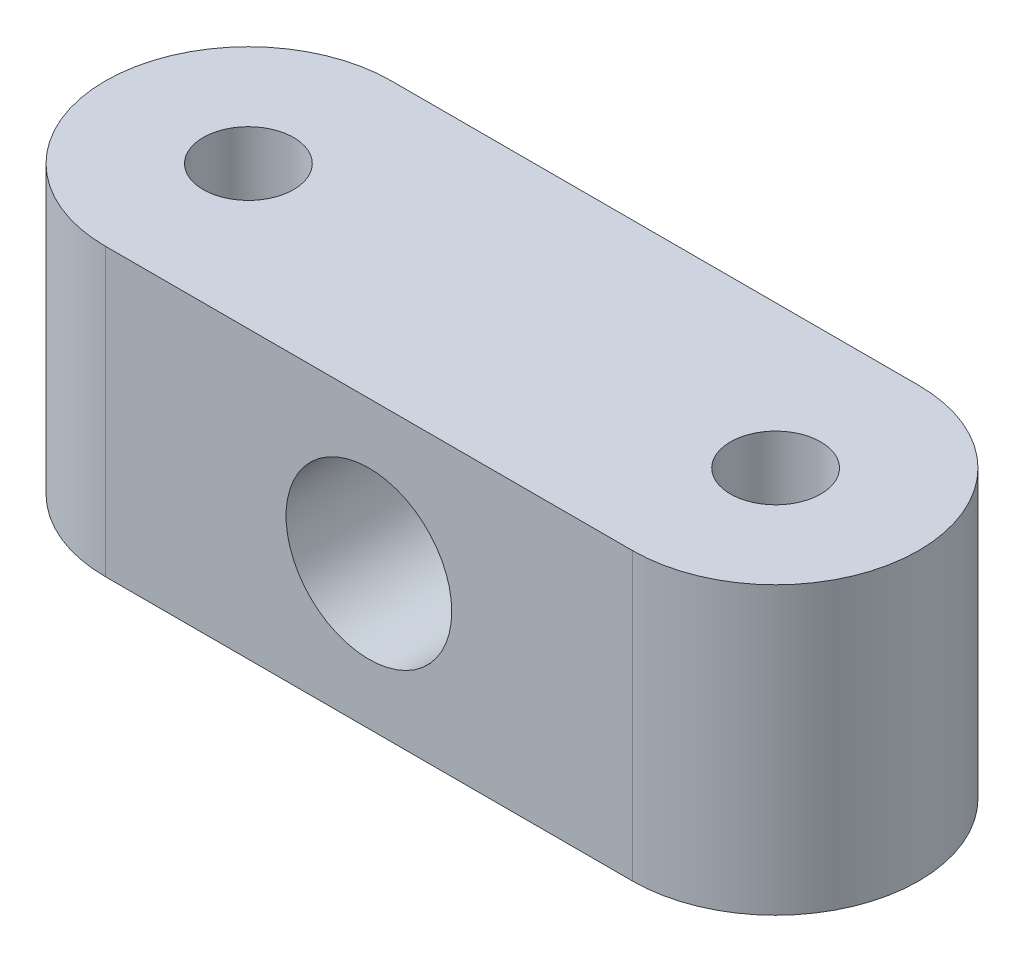
ISO-10303-21;
HEADER;
FILE_DESCRIPTION(('STEP AP214'),'2;1');
FILE_NAME('part.step','',(''),(''),'','','');
FILE_SCHEMA(('AUTOMOTIVE_DESIGN { 1 0 10303 214 1 1 1 1 }'));
ENDSEC;
DATA;
#1=APPLICATION_CONTEXT('core data for automotive mechanical design processes');
#2=APPLICATION_PROTOCOL_DEFINITION('international standard','automotive_design',2000,#1);
#3=PRODUCT_CONTEXT('',#1,'mechanical');
#4=PRODUCT('Part','Part','',(#3));
#5=PRODUCT_RELATED_PRODUCT_CATEGORY('part','',(#4));
#6=PRODUCT_DEFINITION_FORMATION('','',#4);
#7=PRODUCT_DEFINITION_CONTEXT('part definition',#1,'design');
#8=PRODUCT_DEFINITION('design','',#6,#7);
#9=PRODUCT_DEFINITION_SHAPE('','',#8);
#10=(LENGTH_UNIT() NAMED_UNIT(*) SI_UNIT(.MILLI.,.METRE.));
#11=(NAMED_UNIT(*) PLANE_ANGLE_UNIT() SI_UNIT($,.RADIAN.));
#12=(NAMED_UNIT(*) SI_UNIT($,.STERADIAN.) SOLID_ANGLE_UNIT());
#13=UNCERTAINTY_MEASURE_WITH_UNIT(LENGTH_MEASURE(1.E-05),#10,'distance_accuracy_value','');
#14=(GEOMETRIC_REPRESENTATION_CONTEXT(3) GLOBAL_UNCERTAINTY_ASSIGNED_CONTEXT((#13)) GLOBAL_UNIT_ASSIGNED_CONTEXT((#10,
#11,#12)) REPRESENTATION_CONTEXT('',''));
#15=CARTESIAN_POINT('',(0.,0.,0.));
#16=DIRECTION('',(0.,0.,1.));
#17=DIRECTION('',(1.,0.,0.));
#18=AXIS2_PLACEMENT_3D('',#15,#16,#17);
#19=CARTESIAN_POINT('',(35.,38.,0.));
#20=DIRECTION('',(0.,-1.,0.));
#21=DIRECTION('',(0.,0.,-1.));
#22=AXIS2_PLACEMENT_3D('',#19,#20,#21);
#23=PLANE('',#22);
#24=CARTESIAN_POINT('',(35.,38.,0.));
#25=DIRECTION('',(0.,1.,0.));
#26=DIRECTION('',(0.,0.,-1.));
#27=AXIS2_PLACEMENT_3D('',#24,#25,#26);
#28=CIRCLE('',#27,19.);
#29=CARTESIAN_POINT('',(35.,38.,19.));
#30=VERTEX_POINT('',#29);
#31=CARTESIAN_POINT('',(35.,38.,-19.));
#32=VERTEX_POINT('',#31);
#33=EDGE_CURVE('E91',#30,#32,#28,.T.);
#34=ORIENTED_EDGE('',*,*,#33,.T.);
#35=DIRECTION('',(-1.,0.,0.));
#36=VECTOR('',#35,1.);
#37=CARTESIAN_POINT('',(-35.,38.,-19.));
#38=LINE('',#37,#36);
#39=CARTESIAN_POINT('',(-35.,38.,-19.));
#40=VERTEX_POINT('',#39);
#41=EDGE_CURVE('E86',#32,#40,#38,.T.);
#42=ORIENTED_EDGE('',*,*,#41,.T.);
#43=CARTESIAN_POINT('',(-35.,38.,0.));
#44=DIRECTION('',(0.,1.,0.));
#45=DIRECTION('',(0.,0.,1.));
#46=AXIS2_PLACEMENT_3D('',#43,#44,#45);
#47=CIRCLE('',#46,19.);
#48=CARTESIAN_POINT('',(-35.,38.,19.));
#49=VERTEX_POINT('',#48);
#50=EDGE_CURVE('E89',#40,#49,#47,.T.);
#51=ORIENTED_EDGE('',*,*,#50,.T.);
#52=DIRECTION('',(1.,0.,0.));
#53=VECTOR('',#52,1.);
#54=CARTESIAN_POINT('',(-35.,38.,19.));
#55=LINE('',#54,#53);
#56=EDGE_CURVE('E56',#49,#30,#55,.T.);
#57=ORIENTED_EDGE('',*,*,#56,.T.);
#58=EDGE_LOOP('',(#34,#42,#51,#57));
#59=FACE_BOUND('',#58,.T.);
#60=CARTESIAN_POINT('',(-35.,38.,0.));
#61=DIRECTION('',(0.,1.,0.));
#62=DIRECTION('',(0.,0.,1.));
#63=AXIS2_PLACEMENT_3D('',#60,#61,#62);
#64=CIRCLE('',#63,6.);
#65=CARTESIAN_POINT('',(-35.,38.,6.));
#66=VERTEX_POINT('',#65);
#67=EDGE_CURVE('E106',#66,#66,#64,.T.);
#68=ORIENTED_EDGE('',*,*,#67,.F.);
#69=EDGE_LOOP('',(#68));
#70=FACE_BOUND('',#69,.T.);
#71=CARTESIAN_POINT('',(35.,38.,0.));
#72=DIRECTION('',(0.,1.,0.));
#73=DIRECTION('',(0.,0.,-1.));
#74=AXIS2_PLACEMENT_3D('',#71,#72,#73);
#75=CIRCLE('',#74,6.);
#76=CARTESIAN_POINT('',(35.,38.,-6.));
#77=VERTEX_POINT('',#76);
#78=EDGE_CURVE('E121',#77,#77,#75,.T.);
#79=ORIENTED_EDGE('',*,*,#78,.F.);
#80=EDGE_LOOP('',(#79));
#81=FACE_BOUND('',#80,.T.);
#82=ADVANCED_FACE('F39',(#59,#70,#81),#23,.F.);
#83=CARTESIAN_POINT('',(35.,0.,0.));
#84=DIRECTION('',(0.,-1.,0.));
#85=DIRECTION('',(0.,0.,-1.));
#86=AXIS2_PLACEMENT_3D('',#83,#84,#85);
#87=PLANE('',#86);
#88=CARTESIAN_POINT('',(-35.,0.,0.));
#89=DIRECTION('',(0.,1.,0.));
#90=DIRECTION('',(0.,0.,1.));
#91=AXIS2_PLACEMENT_3D('',#88,#89,#90);
#92=CIRCLE('',#91,6.);
#93=CARTESIAN_POINT('',(-35.,0.,6.));
#94=VERTEX_POINT('',#93);
#95=EDGE_CURVE('E118',#94,#94,#92,.T.);
#96=ORIENTED_EDGE('',*,*,#95,.T.);
#97=EDGE_LOOP('',(#96));
#98=FACE_BOUND('',#97,.T.);
#99=CARTESIAN_POINT('',(35.,0.,0.));
#100=DIRECTION('',(0.,1.,0.));
#101=DIRECTION('',(0.,0.,-1.));
#102=AXIS2_PLACEMENT_3D('',#99,#100,#101);
#103=CIRCLE('',#102,19.);
#104=CARTESIAN_POINT('',(35.,0.,19.));
#105=VERTEX_POINT('',#104);
#106=CARTESIAN_POINT('',(35.,0.,-19.));
#107=VERTEX_POINT('',#106);
#108=EDGE_CURVE('E103',#105,#107,#103,.T.);
#109=ORIENTED_EDGE('',*,*,#108,.F.);
#110=DIRECTION('',(1.,0.,0.));
#111=VECTOR('',#110,1.);
#112=CARTESIAN_POINT('',(-35.,0.,19.));
#113=LINE('',#112,#111);
#114=CARTESIAN_POINT('',(-35.,0.,19.));
#115=VERTEX_POINT('',#114);
#116=EDGE_CURVE('E79',#115,#105,#113,.T.);
#117=ORIENTED_EDGE('',*,*,#116,.F.);
#118=CARTESIAN_POINT('',(-35.,0.,0.));
#119=DIRECTION('',(0.,1.,0.));
#120=DIRECTION('',(0.,0.,1.));
#121=AXIS2_PLACEMENT_3D('',#118,#119,#120);
#122=CIRCLE('',#121,19.);
#123=CARTESIAN_POINT('',(-35.,0.,-19.));
#124=VERTEX_POINT('',#123);
#125=EDGE_CURVE('E73',#124,#115,#122,.T.);
#126=ORIENTED_EDGE('',*,*,#125,.F.);
#127=DIRECTION('',(-1.,0.,0.));
#128=VECTOR('',#127,1.);
#129=CARTESIAN_POINT('',(-35.,0.,-19.));
#130=LINE('',#129,#128);
#131=EDGE_CURVE('E95',#107,#124,#130,.T.);
#132=ORIENTED_EDGE('',*,*,#131,.F.);
#133=EDGE_LOOP('',(#109,#117,#126,#132));
#134=FACE_BOUND('',#133,.T.);
#135=CARTESIAN_POINT('',(35.,0.,0.));
#136=DIRECTION('',(0.,1.,0.));
#137=DIRECTION('',(0.,0.,-1.));
#138=AXIS2_PLACEMENT_3D('',#135,#136,#137);
#139=CIRCLE('',#138,6.);
#140=CARTESIAN_POINT('',(35.,0.,-6.));
#141=VERTEX_POINT('',#140);
#142=EDGE_CURVE('E124',#141,#141,#139,.T.);
#143=ORIENTED_EDGE('',*,*,#142,.T.);
#144=EDGE_LOOP('',(#143));
#145=FACE_BOUND('',#144,.T.);
#146=ADVANCED_FACE('F114',(#98,#134,#145),#87,.T.);
#147=CARTESIAN_POINT('',(35.,38.,0.));
#148=DIRECTION('',(0.,-1.,0.));
#149=DIRECTION('',(0.,0.,-1.));
#150=AXIS2_PLACEMENT_3D('',#147,#148,#149);
#151=CYLINDRICAL_SURFACE('',#150,19.);
#152=ORIENTED_EDGE('',*,*,#108,.T.);
#153=DIRECTION('',(0.,-1.,0.));
#154=VECTOR('',#153,1.);
#155=CARTESIAN_POINT('',(35.,38.,-19.));
#156=LINE('',#155,#154);
#157=EDGE_CURVE('E11',#32,#107,#156,.T.);
#158=ORIENTED_EDGE('',*,*,#157,.F.);
#159=ORIENTED_EDGE('',*,*,#33,.F.);
#160=DIRECTION('',(0.,-1.,0.));
#161=VECTOR('',#160,1.);
#162=CARTESIAN_POINT('',(35.,38.,19.));
#163=LINE('',#162,#161);
#164=EDGE_CURVE('E99',#30,#105,#163,.T.);
#165=ORIENTED_EDGE('',*,*,#164,.T.);
#166=EDGE_LOOP('',(#152,#158,#159,#165));
#167=FACE_BOUND('',#166,.T.);
#168=ADVANCED_FACE('F41',(#167),#151,.T.);
#169=CARTESIAN_POINT('',(-35.,38.,-19.));
#170=DIRECTION('',(0.,0.,1.));
#171=DIRECTION('',(1.,0.,0.));
#172=AXIS2_PLACEMENT_3D('',#169,#170,#171);
#173=PLANE('',#172);
#174=CARTESIAN_POINT('',(0.,19.,-19.));
#175=DIRECTION('',(0.,0.,1.));
#176=DIRECTION('',(1.,0.,0.));
#177=AXIS2_PLACEMENT_3D('',#174,#175,#176);
#178=CIRCLE('',#177,11.);
#179=CARTESIAN_POINT('',(11.,19.,-19.));
#180=VERTEX_POINT('',#179);
#181=EDGE_CURVE('E127',#180,#180,#178,.T.);
#182=ORIENTED_EDGE('',*,*,#181,.T.);
#183=EDGE_LOOP('',(#182));
#184=FACE_BOUND('',#183,.T.);
#185=ORIENTED_EDGE('',*,*,#131,.T.);
#186=DIRECTION('',(0.,-1.,0.));
#187=VECTOR('',#186,1.);
#188=CARTESIAN_POINT('',(-35.,38.,-19.));
#189=LINE('',#188,#187);
#190=EDGE_CURVE('E48',#40,#124,#189,.T.);
#191=ORIENTED_EDGE('',*,*,#190,.F.);
#192=ORIENTED_EDGE('',*,*,#41,.F.);
#193=ORIENTED_EDGE('',*,*,#157,.T.);
#194=EDGE_LOOP('',(#185,#191,#192,#193));
#195=FACE_BOUND('',#194,.T.);
#196=ADVANCED_FACE('F94',(#184,#195),#173,.F.);
#197=CARTESIAN_POINT('',(-35.,38.,0.));
#198=DIRECTION('',(0.,-1.,0.));
#199=DIRECTION('',(0.,0.,-1.));
#200=AXIS2_PLACEMENT_3D('',#197,#198,#199);
#201=CYLINDRICAL_SURFACE('',#200,19.);
#202=ORIENTED_EDGE('',*,*,#125,.T.);
#203=DIRECTION('',(0.,-1.,0.));
#204=VECTOR('',#203,1.);
#205=CARTESIAN_POINT('',(-35.,38.,19.));
#206=LINE('',#205,#204);
#207=EDGE_CURVE('E96',#49,#115,#206,.T.);
#208=ORIENTED_EDGE('',*,*,#207,.F.);
#209=ORIENTED_EDGE('',*,*,#50,.F.);
#210=ORIENTED_EDGE('',*,*,#190,.T.);
#211=EDGE_LOOP('',(#202,#208,#209,#210));
#212=FACE_BOUND('',#211,.T.);
#213=ADVANCED_FACE('F97',(#212),#201,.T.);
#214=CARTESIAN_POINT('',(-35.,38.,19.));
#215=DIRECTION('',(0.,0.,-1.));
#216=DIRECTION('',(-1.,0.,0.));
#217=AXIS2_PLACEMENT_3D('',#214,#215,#216);
#218=PLANE('',#217);
#219=CARTESIAN_POINT('',(0.,19.,19.));
#220=DIRECTION('',(0.,0.,1.));
#221=DIRECTION('',(1.,0.,0.));
#222=AXIS2_PLACEMENT_3D('',#219,#220,#221);
#223=CIRCLE('',#222,11.);
#224=CARTESIAN_POINT('',(11.,19.,19.));
#225=VERTEX_POINT('',#224);
#226=EDGE_CURVE('E132',#225,#225,#223,.T.);
#227=ORIENTED_EDGE('',*,*,#226,.F.);
#228=EDGE_LOOP('',(#227));
#229=FACE_BOUND('',#228,.T.);
#230=ORIENTED_EDGE('',*,*,#116,.T.);
#231=ORIENTED_EDGE('',*,*,#164,.F.);
#232=ORIENTED_EDGE('',*,*,#56,.F.);
#233=ORIENTED_EDGE('',*,*,#207,.T.);
#234=EDGE_LOOP('',(#230,#231,#232,#233));
#235=FACE_BOUND('',#234,.T.);
#236=ADVANCED_FACE('F111',(#229,#235),#218,.F.);
#237=CARTESIAN_POINT('',(-35.,38.,0.));
#238=DIRECTION('',(0.,-1.,0.));
#239=DIRECTION('',(0.,0.,-1.));
#240=AXIS2_PLACEMENT_3D('',#237,#238,#239);
#241=CYLINDRICAL_SURFACE('',#240,6.);
#242=ORIENTED_EDGE('',*,*,#67,.T.);
#243=EDGE_LOOP('',(#242));
#244=FACE_BOUND('',#243,.T.);
#245=ORIENTED_EDGE('',*,*,#95,.F.);
#246=EDGE_LOOP('',(#245));
#247=FACE_BOUND('',#246,.T.);
#248=ADVANCED_FACE('F139',(#244,#247),#241,.F.);
#249=CARTESIAN_POINT('',(35.,38.,0.));
#250=DIRECTION('',(0.,-1.,0.));
#251=DIRECTION('',(0.,0.,-1.));
#252=AXIS2_PLACEMENT_3D('',#249,#250,#251);
#253=CYLINDRICAL_SURFACE('',#252,6.);
#254=ORIENTED_EDGE('',*,*,#78,.T.);
#255=EDGE_LOOP('',(#254));
#256=FACE_BOUND('',#255,.T.);
#257=ORIENTED_EDGE('',*,*,#142,.F.);
#258=EDGE_LOOP('',(#257));
#259=FACE_BOUND('',#258,.T.);
#260=ADVANCED_FACE('F146',(#256,#259),#253,.F.);
#261=CARTESIAN_POINT('',(0.,19.,19.));
#262=DIRECTION('',(0.,0.,1.));
#263=DIRECTION('',(1.,0.,0.));
#264=AXIS2_PLACEMENT_3D('',#261,#262,#263);
#265=CYLINDRICAL_SURFACE('',#264,11.);
#266=ORIENTED_EDGE('',*,*,#181,.F.);
#267=EDGE_LOOP('',(#266));
#268=FACE_BOUND('',#267,.T.);
#269=ORIENTED_EDGE('',*,*,#226,.T.);
#270=EDGE_LOOP('',(#269));
#271=FACE_BOUND('',#270,.T.);
#272=ADVANCED_FACE('F136',(#268,#271),#265,.F.);
#273=CLOSED_SHELL('',(#82,#146,#168,#196,#213,#236,#248,#260,#272));
#274=MANIFOLD_SOLID_BREP('B2',#273);
#275=ADVANCED_BREP_SHAPE_REPRESENTATION('',(#18,#274),#14);
#276=SHAPE_DEFINITION_REPRESENTATION(#9,#275);
ENDSEC;
END-ISO-10303-21;
